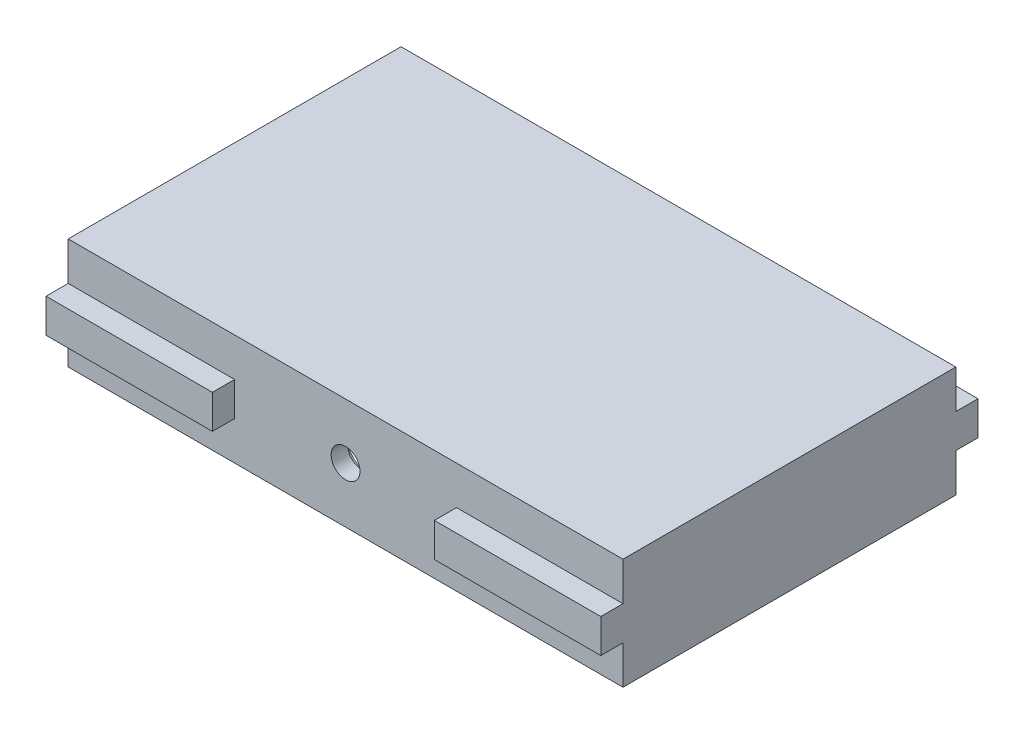
ISO-10303-21;
HEADER;
FILE_DESCRIPTION(('STEP AP214'),'2;1');
FILE_NAME('part.step','',(''),(''),'','','');
FILE_SCHEMA(('AUTOMOTIVE_DESIGN { 1 0 10303 214 1 1 1 1 }'));
ENDSEC;
DATA;
#1=APPLICATION_CONTEXT('core data for automotive mechanical design processes');
#2=APPLICATION_PROTOCOL_DEFINITION('international standard','automotive_design',2000,#1);
#3=PRODUCT_CONTEXT('',#1,'mechanical');
#4=PRODUCT('Part','Part','',(#3));
#5=PRODUCT_RELATED_PRODUCT_CATEGORY('part','',(#4));
#6=PRODUCT_DEFINITION_FORMATION('','',#4);
#7=PRODUCT_DEFINITION_CONTEXT('part definition',#1,'design');
#8=PRODUCT_DEFINITION('design','',#6,#7);
#9=PRODUCT_DEFINITION_SHAPE('','',#8);
#10=(LENGTH_UNIT() NAMED_UNIT(*) SI_UNIT(.MILLI.,.METRE.));
#11=(NAMED_UNIT(*) PLANE_ANGLE_UNIT() SI_UNIT($,.RADIAN.));
#12=(NAMED_UNIT(*) SI_UNIT($,.STERADIAN.) SOLID_ANGLE_UNIT());
#13=UNCERTAINTY_MEASURE_WITH_UNIT(LENGTH_MEASURE(1.E-05),#10,'distance_accuracy_value','');
#14=(GEOMETRIC_REPRESENTATION_CONTEXT(3) GLOBAL_UNCERTAINTY_ASSIGNED_CONTEXT((#13)) GLOBAL_UNIT_ASSIGNED_CONTEXT((#10,
#11,#12)) REPRESENTATION_CONTEXT('',''));
#15=CARTESIAN_POINT('',(0.,0.,0.));
#16=DIRECTION('',(0.,0.,1.));
#17=DIRECTION('',(1.,0.,0.));
#18=AXIS2_PLACEMENT_3D('',#15,#16,#17);
#19=CARTESIAN_POINT('',(-20.4498016419006,20.,43.5554216788532));
#20=DIRECTION('',(0.,0.,-1.));
#21=DIRECTION('',(-1.,0.,0.));
#22=AXIS2_PLACEMENT_3D('',#19,#20,#21);
#23=PLANE('',#22);
#24=CARTESIAN_POINT('',(29.5501983580994,10.,43.5554216788532));
#25=DIRECTION('',(0.,0.,1.));
#26=DIRECTION('',(1.,0.,0.));
#27=AXIS2_PLACEMENT_3D('',#24,#25,#26);
#28=CIRCLE('',#27,2.6);
#29=CARTESIAN_POINT('',(32.1501983580994,10.,43.5554216788532));
#30=VERTEX_POINT('',#29);
#31=EDGE_CURVE('E386',#30,#30,#28,.T.);
#32=ORIENTED_EDGE('',*,*,#31,.F.);
#33=EDGE_LOOP('',(#32));
#34=FACE_BOUND('',#33,.T.);
#35=DIRECTION('',(0.,-1.,0.));
#36=VECTOR('',#35,1.);
#37=CARTESIAN_POINT('',(79.5501983580994,20.,43.5554216788532));
#38=LINE('',#37,#36);
#39=CARTESIAN_POINT('',(79.5501983580994,6.94999999999999,43.5554216788532));
#40=VERTEX_POINT('',#39);
#41=CARTESIAN_POINT('',(79.5501983580994,0.,43.5554216788532));
#42=VERTEX_POINT('',#41);
#43=EDGE_CURVE('E479',#40,#42,#38,.T.);
#44=ORIENTED_EDGE('',*,*,#43,.F.);
#45=DIRECTION('',(-1.,0.,0.));
#46=VECTOR('',#45,1.);
#47=CARTESIAN_POINT('',(0.,6.94999999999998,43.5554216788532));
#48=LINE('',#47,#46);
#49=CARTESIAN_POINT('',(49.5501983580994,6.94999999999999,43.5554216788532));
#50=VERTEX_POINT('',#49);
#51=EDGE_CURVE('E59',#40,#50,#48,.T.);
#52=ORIENTED_EDGE('',*,*,#51,.T.);
#53=DIRECTION('',(0.,1.,0.));
#54=VECTOR('',#53,1.);
#55=CARTESIAN_POINT('',(49.5501983580994,0.,43.5554216788532));
#56=LINE('',#55,#54);
#57=CARTESIAN_POINT('',(49.5501983580994,13.05,43.5554216788532));
#58=VERTEX_POINT('',#57);
#59=EDGE_CURVE('E216',#50,#58,#56,.T.);
#60=ORIENTED_EDGE('',*,*,#59,.T.);
#61=DIRECTION('',(-1.,0.,0.));
#62=VECTOR('',#61,1.);
#63=CARTESIAN_POINT('',(0.,13.05,43.5554216788532));
#64=LINE('',#63,#62);
#65=CARTESIAN_POINT('',(79.5501983580994,13.05,43.5554216788532));
#66=VERTEX_POINT('',#65);
#67=EDGE_CURVE('E229',#66,#58,#64,.T.);
#68=ORIENTED_EDGE('',*,*,#67,.F.);
#69=CARTESIAN_POINT('',(79.5501983580994,20.,43.5554216788532));
#70=VERTEX_POINT('',#69);
#71=EDGE_CURVE('E480',#70,#66,#38,.T.);
#72=ORIENTED_EDGE('',*,*,#71,.F.);
#73=DIRECTION('',(1.,0.,0.));
#74=VECTOR('',#73,1.);
#75=CARTESIAN_POINT('',(-20.4498016419006,20.,43.5554216788532));
#76=LINE('',#75,#74);
#77=CARTESIAN_POINT('',(-20.4498016419006,20.,43.5554216788532));
#78=VERTEX_POINT('',#77);
#79=EDGE_CURVE('E446',#78,#70,#76,.T.);
#80=ORIENTED_EDGE('',*,*,#79,.F.);
#81=DIRECTION('',(0.,-1.,0.));
#82=VECTOR('',#81,1.);
#83=CARTESIAN_POINT('',(-20.4498016419006,20.,43.5554216788532));
#84=LINE('',#83,#82);
#85=CARTESIAN_POINT('',(-20.4498016419006,13.05,43.5554216788532));
#86=VERTEX_POINT('',#85);
#87=EDGE_CURVE('E11',#78,#86,#84,.T.);
#88=ORIENTED_EDGE('',*,*,#87,.T.);
#89=DIRECTION('',(1.,0.,0.));
#90=VECTOR('',#89,1.);
#91=CARTESIAN_POINT('',(0.,13.05,43.5554216788532));
#92=LINE('',#91,#90);
#93=CARTESIAN_POINT('',(9.55019835809942,13.05,43.5554216788532));
#94=VERTEX_POINT('',#93);
#95=EDGE_CURVE('E274',#86,#94,#92,.T.);
#96=ORIENTED_EDGE('',*,*,#95,.T.);
#97=DIRECTION('',(0.,-1.,0.));
#98=VECTOR('',#97,1.);
#99=CARTESIAN_POINT('',(9.55019835809942,0.,43.5554216788532));
#100=LINE('',#99,#98);
#101=CARTESIAN_POINT('',(9.55019835809942,6.94999999999999,43.5554216788532));
#102=VERTEX_POINT('',#101);
#103=EDGE_CURVE('E67',#94,#102,#100,.T.);
#104=ORIENTED_EDGE('',*,*,#103,.T.);
#105=DIRECTION('',(1.,0.,0.));
#106=VECTOR('',#105,1.);
#107=CARTESIAN_POINT('',(0.,6.94999999999999,43.5554216788532));
#108=LINE('',#107,#106);
#109=CARTESIAN_POINT('',(-20.4498016419006,6.94999999999999,43.5554216788532));
#110=VERTEX_POINT('',#109);
#111=EDGE_CURVE('E261',#110,#102,#108,.T.);
#112=ORIENTED_EDGE('',*,*,#111,.F.);
#113=CARTESIAN_POINT('',(-20.4498016419006,0.,43.5554216788532));
#114=VERTEX_POINT('',#113);
#115=EDGE_CURVE('E51',#110,#114,#84,.T.);
#116=ORIENTED_EDGE('',*,*,#115,.T.);
#117=DIRECTION('',(1.,0.,0.));
#118=VECTOR('',#117,1.);
#119=CARTESIAN_POINT('',(-20.4498016419006,0.,43.5554216788532));
#120=LINE('',#119,#118);
#121=EDGE_CURVE('E460',#114,#42,#120,.T.);
#122=ORIENTED_EDGE('',*,*,#121,.T.);
#123=EDGE_LOOP('',(#44,#52,#60,#68,#72,#80,#88,#96,#104,#112,#116,#122));
#124=FACE_BOUND('',#123,.T.);
#125=ADVANCED_FACE('F41',(#34,#124),#23,.F.);
#126=CARTESIAN_POINT('',(-20.4498016419006,20.,-16.4445783211468));
#127=DIRECTION('',(0.,0.,1.));
#128=DIRECTION('',(1.,0.,0.));
#129=AXIS2_PLACEMENT_3D('',#126,#127,#128);
#130=PLANE('',#129);
#131=CARTESIAN_POINT('',(29.5501983580994,10.,-16.4445783211468));
#132=DIRECTION('',(0.,0.,1.));
#133=DIRECTION('',(1.,0.,0.));
#134=AXIS2_PLACEMENT_3D('',#131,#132,#133);
#135=CIRCLE('',#134,2.6);
#136=CARTESIAN_POINT('',(32.1501983580994,10.,-16.4445783211468));
#137=VERTEX_POINT('',#136);
#138=EDGE_CURVE('E390',#137,#137,#135,.T.);
#139=ORIENTED_EDGE('',*,*,#138,.T.);
#140=EDGE_LOOP('',(#139));
#141=FACE_BOUND('',#140,.T.);
#142=DIRECTION('',(0.,-1.,0.));
#143=VECTOR('',#142,1.);
#144=CARTESIAN_POINT('',(79.5501983580994,20.,-16.4445783211468));
#145=LINE('',#144,#143);
#146=CARTESIAN_POINT('',(79.5501983580994,20.,-16.4445783211468));
#147=VERTEX_POINT('',#146);
#148=CARTESIAN_POINT('',(79.5501983580994,13.05,-16.4445783211468));
#149=VERTEX_POINT('',#148);
#150=EDGE_CURVE('E476',#147,#149,#145,.T.);
#151=ORIENTED_EDGE('',*,*,#150,.T.);
#152=DIRECTION('',(-1.,0.,0.));
#153=VECTOR('',#152,1.);
#154=CARTESIAN_POINT('',(0.,13.05,-16.4445783211468));
#155=LINE('',#154,#153);
#156=CARTESIAN_POINT('',(49.5501983580995,13.05,-16.4445783211468));
#157=VERTEX_POINT('',#156);
#158=EDGE_CURVE('E311',#149,#157,#155,.T.);
#159=ORIENTED_EDGE('',*,*,#158,.T.);
#160=DIRECTION('',(0.,-1.,0.));
#161=VECTOR('',#160,1.);
#162=CARTESIAN_POINT('',(49.5501983580994,0.,-16.4445783211468));
#163=LINE('',#162,#161);
#164=CARTESIAN_POINT('',(49.5501983580995,6.94999999999999,-16.4445783211468));
#165=VERTEX_POINT('',#164);
#166=EDGE_CURVE('E292',#157,#165,#163,.T.);
#167=ORIENTED_EDGE('',*,*,#166,.T.);
#168=DIRECTION('',(-1.,0.,0.));
#169=VECTOR('',#168,1.);
#170=CARTESIAN_POINT('',(0.,6.94999999999999,-16.4445783211468));
#171=LINE('',#170,#169);
#172=CARTESIAN_POINT('',(79.5501983580994,6.94999999999999,-16.4445783211468));
#173=VERTEX_POINT('',#172);
#174=EDGE_CURVE('E298',#173,#165,#171,.T.);
#175=ORIENTED_EDGE('',*,*,#174,.F.);
#176=CARTESIAN_POINT('',(79.5501983580994,0.,-16.4445783211468));
#177=VERTEX_POINT('',#176);
#178=EDGE_CURVE('E475',#173,#177,#145,.T.);
#179=ORIENTED_EDGE('',*,*,#178,.T.);
#180=DIRECTION('',(-1.,0.,0.));
#181=VECTOR('',#180,1.);
#182=CARTESIAN_POINT('',(-20.4498016419006,0.,-16.4445783211468));
#183=LINE('',#182,#181);
#184=CARTESIAN_POINT('',(-20.4498016419006,0.,-16.4445783211468));
#185=VERTEX_POINT('',#184);
#186=EDGE_CURVE('E447',#177,#185,#183,.T.);
#187=ORIENTED_EDGE('',*,*,#186,.T.);
#188=DIRECTION('',(0.,-1.,0.));
#189=VECTOR('',#188,1.);
#190=CARTESIAN_POINT('',(-20.4498016419006,20.,-16.4445783211468));
#191=LINE('',#190,#189);
#192=CARTESIAN_POINT('',(-20.4498016419006,6.94999999999999,-16.4445783211468));
#193=VERTEX_POINT('',#192);
#194=EDGE_CURVE('E456',#193,#185,#191,.T.);
#195=ORIENTED_EDGE('',*,*,#194,.F.);
#196=DIRECTION('',(1.,0.,0.));
#197=VECTOR('',#196,1.);
#198=CARTESIAN_POINT('',(0.,6.94999999999999,-16.4445783211468));
#199=LINE('',#198,#197);
#200=CARTESIAN_POINT('',(9.55019835809942,6.94999999999999,-16.4445783211468));
#201=VERTEX_POINT('',#200);
#202=EDGE_CURVE('E352',#193,#201,#199,.T.);
#203=ORIENTED_EDGE('',*,*,#202,.T.);
#204=DIRECTION('',(0.,1.,0.));
#205=VECTOR('',#204,1.);
#206=CARTESIAN_POINT('',(9.55019835809942,0.,-16.4445783211468));
#207=LINE('',#206,#205);
#208=CARTESIAN_POINT('',(9.55019835809942,13.05,-16.4445783211468));
#209=VERTEX_POINT('',#208);
#210=EDGE_CURVE('E332',#201,#209,#207,.T.);
#211=ORIENTED_EDGE('',*,*,#210,.T.);
#212=DIRECTION('',(1.,0.,0.));
#213=VECTOR('',#212,1.);
#214=CARTESIAN_POINT('',(0.,13.05,-16.4445783211468));
#215=LINE('',#214,#213);
#216=CARTESIAN_POINT('',(-20.4498016419006,13.05,-16.4445783211468));
#217=VERTEX_POINT('',#216);
#218=EDGE_CURVE('E338',#217,#209,#215,.T.);
#219=ORIENTED_EDGE('',*,*,#218,.F.);
#220=CARTESIAN_POINT('',(-20.4498016419006,20.,-16.4445783211468));
#221=VERTEX_POINT('',#220);
#222=EDGE_CURVE('E471',#221,#217,#191,.T.);
#223=ORIENTED_EDGE('',*,*,#222,.F.);
#224=DIRECTION('',(-1.,0.,0.));
#225=VECTOR('',#224,1.);
#226=CARTESIAN_POINT('',(-20.4498016419006,20.,-16.4445783211468));
#227=LINE('',#226,#225);
#228=EDGE_CURVE('E453',#147,#221,#227,.T.);
#229=ORIENTED_EDGE('',*,*,#228,.F.);
#230=EDGE_LOOP('',(#151,#159,#167,#175,#179,#187,#195,#203,#211,#219,#223,#229));
#231=FACE_BOUND('',#230,.T.);
#232=ADVANCED_FACE('F501',(#141,#231),#130,.F.);
#233=CARTESIAN_POINT('',(29.5501983580994,10.,-156.444578321147));
#234=DIRECTION('',(0.,0.,1.));
#235=DIRECTION('',(1.,0.,0.));
#236=AXIS2_PLACEMENT_3D('',#233,#234,#235);
#237=CYLINDRICAL_SURFACE('',#236,2.6);
#238=ORIENTED_EDGE('',*,*,#31,.T.);
#239=EDGE_LOOP('',(#238));
#240=FACE_BOUND('',#239,.T.);
#241=CARTESIAN_POINT('',(29.5501983580994,10.,40.5554216788532));
#242=DIRECTION('',(0.,0.,-1.));
#243=DIRECTION('',(-1.,0.,0.));
#244=AXIS2_PLACEMENT_3D('',#241,#242,#243);
#245=CIRCLE('',#244,2.6);
#246=CARTESIAN_POINT('',(26.9501983580994,10.,40.5554216788532));
#247=VERTEX_POINT('',#246);
#248=EDGE_CURVE('E45',#247,#247,#245,.F.);
#249=ORIENTED_EDGE('',*,*,#248,.F.);
#250=EDGE_LOOP('',(#249));
#251=FACE_BOUND('',#250,.T.);
#252=ADVANCED_FACE('F492',(#240,#251),#237,.F.);
#253=ORIENTED_EDGE('',*,*,#138,.F.);
#254=EDGE_LOOP('',(#253));
#255=FACE_BOUND('',#254,.T.);
#256=CARTESIAN_POINT('',(29.5501983580994,10.,-13.4445783211468));
#257=DIRECTION('',(0.,0.,1.));
#258=DIRECTION('',(1.,0.,0.));
#259=AXIS2_PLACEMENT_3D('',#256,#257,#258);
#260=CIRCLE('',#259,2.6);
#261=CARTESIAN_POINT('',(32.1501983580994,10.,-13.4445783211468));
#262=VERTEX_POINT('',#261);
#263=EDGE_CURVE('E382',#262,#262,#260,.F.);
#264=ORIENTED_EDGE('',*,*,#263,.F.);
#265=EDGE_LOOP('',(#264));
#266=FACE_BOUND('',#265,.T.);
#267=ADVANCED_FACE('F489',(#255,#266),#237,.F.);
#268=CARTESIAN_POINT('',(0.,0.,0.));
#269=DIRECTION('',(0.,1.,0.));
#270=DIRECTION('',(0.,0.,1.));
#271=AXIS2_PLACEMENT_3D('',#268,#269,#270);
#272=PLANE('',#271);
#273=DIRECTION('',(0.,0.,1.));
#274=VECTOR('',#273,1.);
#275=CARTESIAN_POINT('',(-20.4498016419006,0.,-16.4445783211468));
#276=LINE('',#275,#274);
#277=EDGE_CURVE('E432',#185,#114,#276,.T.);
#278=ORIENTED_EDGE('',*,*,#277,.F.);
#279=ORIENTED_EDGE('',*,*,#186,.F.);
#280=DIRECTION('',(0.,0.,-1.));
#281=VECTOR('',#280,1.);
#282=CARTESIAN_POINT('',(79.5501983580994,0.,-16.4445783211468));
#283=LINE('',#282,#281);
#284=EDGE_CURVE('E464',#42,#177,#283,.T.);
#285=ORIENTED_EDGE('',*,*,#284,.F.);
#286=ORIENTED_EDGE('',*,*,#121,.F.);
#287=EDGE_LOOP('',(#278,#279,#285,#286));
#288=FACE_BOUND('',#287,.T.);
#289=DIRECTION('',(0.,0.,-1.));
#290=VECTOR('',#289,1.);
#291=CARTESIAN_POINT('',(74.5501983580994,0.,0.));
#292=LINE('',#291,#290);
#293=CARTESIAN_POINT('',(74.5501983580994,0.,38.5554216788532));
#294=VERTEX_POINT('',#293);
#295=CARTESIAN_POINT('',(74.5501983580994,0.,-11.4445783211468));
#296=VERTEX_POINT('',#295);
#297=EDGE_CURVE('E394',#294,#296,#292,.T.);
#298=ORIENTED_EDGE('',*,*,#297,.T.);
#299=DIRECTION('',(1.,0.,0.));
#300=VECTOR('',#299,1.);
#301=CARTESIAN_POINT('',(0.,0.,-11.4445783211468));
#302=LINE('',#301,#300);
#303=CARTESIAN_POINT('',(-15.4498016419006,0.,-11.4445783211468));
#304=VERTEX_POINT('',#303);
#305=EDGE_CURVE('E400',#304,#296,#302,.T.);
#306=ORIENTED_EDGE('',*,*,#305,.F.);
#307=DIRECTION('',(0.,0.,-1.));
#308=VECTOR('',#307,1.);
#309=CARTESIAN_POINT('',(-15.4498016419006,0.,0.));
#310=LINE('',#309,#308);
#311=CARTESIAN_POINT('',(-15.4498016419006,0.,38.5554216788532));
#312=VERTEX_POINT('',#311);
#313=EDGE_CURVE('E422',#312,#304,#310,.T.);
#314=ORIENTED_EDGE('',*,*,#313,.F.);
#315=DIRECTION('',(1.,0.,0.));
#316=VECTOR('',#315,1.);
#317=CARTESIAN_POINT('',(0.,0.,38.5554216788532));
#318=LINE('',#317,#316);
#319=EDGE_CURVE('E418',#312,#294,#318,.T.);
#320=ORIENTED_EDGE('',*,*,#319,.T.);
#321=EDGE_LOOP('',(#298,#306,#314,#320));
#322=FACE_BOUND('',#321,.T.);
#323=ADVANCED_FACE('F491',(#288,#322),#272,.F.);
#324=CARTESIAN_POINT('',(-20.4498016419006,20.,-16.4445783211468));
#325=DIRECTION('',(1.,0.,0.));
#326=DIRECTION('',(0.,0.,-1.));
#327=AXIS2_PLACEMENT_3D('',#324,#325,#326);
#328=PLANE('',#327);
#329=ORIENTED_EDGE('',*,*,#277,.T.);
#330=ORIENTED_EDGE('',*,*,#115,.F.);
#331=DIRECTION('',(0.,0.,-1.));
#332=VECTOR('',#331,1.);
#333=CARTESIAN_POINT('',(-20.4498016419006,6.94999999999999,47.5554216788532));
#334=LINE('',#333,#332);
#335=CARTESIAN_POINT('',(-20.4498016419006,6.94999999999999,47.5554216788532));
#336=VERTEX_POINT('',#335);
#337=EDGE_CURVE('E283',#336,#110,#334,.T.);
#338=ORIENTED_EDGE('',*,*,#337,.F.);
#339=DIRECTION('',(0.,-1.,0.));
#340=VECTOR('',#339,1.);
#341=CARTESIAN_POINT('',(-20.4498016419006,0.,47.5554216788532));
#342=LINE('',#341,#340);
#343=CARTESIAN_POINT('',(-20.4498016419006,13.05,47.5554216788532));
#344=VERTEX_POINT('',#343);
#345=EDGE_CURVE('E265',#344,#336,#342,.T.);
#346=ORIENTED_EDGE('',*,*,#345,.F.);
#347=DIRECTION('',(0.,0.,-1.));
#348=VECTOR('',#347,1.);
#349=CARTESIAN_POINT('',(-20.4498016419006,13.05,47.5554216788532));
#350=LINE('',#349,#348);
#351=EDGE_CURVE('E286',#344,#86,#350,.T.);
#352=ORIENTED_EDGE('',*,*,#351,.T.);
#353=ORIENTED_EDGE('',*,*,#87,.F.);
#354=DIRECTION('',(0.,0.,1.));
#355=VECTOR('',#354,1.);
#356=CARTESIAN_POINT('',(-20.4498016419006,20.,-16.4445783211468));
#357=LINE('',#356,#355);
#358=EDGE_CURVE('E442',#221,#78,#357,.T.);
#359=ORIENTED_EDGE('',*,*,#358,.F.);
#360=ORIENTED_EDGE('',*,*,#222,.T.);
#361=DIRECTION('',(0.,0.,1.));
#362=VECTOR('',#361,1.);
#363=CARTESIAN_POINT('',(-20.4498016419006,13.05,-20.4445783211468));
#364=LINE('',#363,#362);
#365=CARTESIAN_POINT('',(-20.4498016419006,13.05,-20.4445783211468));
#366=VERTEX_POINT('',#365);
#367=EDGE_CURVE('E361',#366,#217,#364,.T.);
#368=ORIENTED_EDGE('',*,*,#367,.F.);
#369=DIRECTION('',(0.,1.,0.));
#370=VECTOR('',#369,1.);
#371=CARTESIAN_POINT('',(-20.4498016419006,0.,-20.4445783211468));
#372=LINE('',#371,#370);
#373=CARTESIAN_POINT('',(-20.4498016419006,6.94999999999999,-20.4445783211468));
#374=VERTEX_POINT('',#373);
#375=EDGE_CURVE('E342',#374,#366,#372,.T.);
#376=ORIENTED_EDGE('',*,*,#375,.F.);
#377=DIRECTION('',(0.,0.,1.));
#378=VECTOR('',#377,1.);
#379=CARTESIAN_POINT('',(-20.4498016419006,6.94999999999999,-20.4445783211468));
#380=LINE('',#379,#378);
#381=EDGE_CURVE('E364',#374,#193,#380,.T.);
#382=ORIENTED_EDGE('',*,*,#381,.T.);
#383=ORIENTED_EDGE('',*,*,#194,.T.);
#384=EDGE_LOOP('',(#329,#330,#338,#346,#352,#353,#359,#360,#368,#376,#382,#383));
#385=FACE_BOUND('',#384,.T.);
#386=ADVANCED_FACE('F43',(#385),#328,.F.);
#387=CARTESIAN_POINT('',(79.5501983580994,20.,-16.4445783211468));
#388=DIRECTION('',(-1.,0.,0.));
#389=DIRECTION('',(0.,0.,1.));
#390=AXIS2_PLACEMENT_3D('',#387,#388,#389);
#391=PLANE('',#390);
#392=ORIENTED_EDGE('',*,*,#284,.T.);
#393=ORIENTED_EDGE('',*,*,#178,.F.);
#394=DIRECTION('',(0.,0.,1.));
#395=VECTOR('',#394,1.);
#396=CARTESIAN_POINT('',(79.5501983580994,6.94999999999999,-20.4445783211468));
#397=LINE('',#396,#395);
#398=CARTESIAN_POINT('',(79.5501983580994,6.94999999999999,-20.4445783211468));
#399=VERTEX_POINT('',#398);
#400=EDGE_CURVE('E320',#399,#173,#397,.T.);
#401=ORIENTED_EDGE('',*,*,#400,.F.);
#402=DIRECTION('',(0.,-1.,0.));
#403=VECTOR('',#402,1.);
#404=CARTESIAN_POINT('',(79.5501983580994,0.,-20.4445783211468));
#405=LINE('',#404,#403);
#406=CARTESIAN_POINT('',(79.5501983580994,13.05,-20.4445783211468));
#407=VERTEX_POINT('',#406);
#408=EDGE_CURVE('E302',#407,#399,#405,.T.);
#409=ORIENTED_EDGE('',*,*,#408,.F.);
#410=DIRECTION('',(0.,0.,1.));
#411=VECTOR('',#410,1.);
#412=CARTESIAN_POINT('',(79.5501983580994,13.05,-20.4445783211468));
#413=LINE('',#412,#411);
#414=EDGE_CURVE('E324',#407,#149,#413,.T.);
#415=ORIENTED_EDGE('',*,*,#414,.T.);
#416=ORIENTED_EDGE('',*,*,#150,.F.);
#417=DIRECTION('',(0.,0.,-1.));
#418=VECTOR('',#417,1.);
#419=CARTESIAN_POINT('',(79.5501983580994,20.,-16.4445783211468));
#420=LINE('',#419,#418);
#421=EDGE_CURVE('E450',#70,#147,#420,.T.);
#422=ORIENTED_EDGE('',*,*,#421,.F.);
#423=ORIENTED_EDGE('',*,*,#71,.T.);
#424=DIRECTION('',(0.,0.,-1.));
#425=VECTOR('',#424,1.);
#426=CARTESIAN_POINT('',(79.5501983580994,13.05,47.5554216788532));
#427=LINE('',#426,#425);
#428=CARTESIAN_POINT('',(79.5501983580994,13.05,47.5554216788532));
#429=VERTEX_POINT('',#428);
#430=EDGE_CURVE('E251',#429,#66,#427,.T.);
#431=ORIENTED_EDGE('',*,*,#430,.F.);
#432=DIRECTION('',(0.,1.,0.));
#433=VECTOR('',#432,1.);
#434=CARTESIAN_POINT('',(79.5501983580994,0.,47.5554216788532));
#435=LINE('',#434,#433);
#436=CARTESIAN_POINT('',(79.5501983580994,6.94999999999999,47.5554216788532));
#437=VERTEX_POINT('',#436);
#438=EDGE_CURVE('E234',#437,#429,#435,.T.);
#439=ORIENTED_EDGE('',*,*,#438,.F.);
#440=DIRECTION('',(0.,0.,-1.));
#441=VECTOR('',#440,1.);
#442=CARTESIAN_POINT('',(79.5501983580994,6.94999999999999,47.5554216788532));
#443=LINE('',#442,#441);
#444=EDGE_CURVE('E219',#437,#40,#443,.T.);
#445=ORIENTED_EDGE('',*,*,#444,.T.);
#446=ORIENTED_EDGE('',*,*,#43,.T.);
#447=EDGE_LOOP('',(#392,#393,#401,#409,#415,#416,#422,#423,#431,#439,#445,#446));
#448=FACE_BOUND('',#447,.T.);
#449=ADVANCED_FACE('F516',(#448),#391,.F.);
#450=CARTESIAN_POINT('',(0.,20.,0.));
#451=DIRECTION('',(0.,1.,0.));
#452=DIRECTION('',(0.,0.,1.));
#453=AXIS2_PLACEMENT_3D('',#450,#451,#452);
#454=PLANE('',#453);
#455=ORIENTED_EDGE('',*,*,#358,.T.);
#456=ORIENTED_EDGE('',*,*,#79,.T.);
#457=ORIENTED_EDGE('',*,*,#421,.T.);
#458=ORIENTED_EDGE('',*,*,#228,.T.);
#459=EDGE_LOOP('',(#455,#456,#457,#458));
#460=FACE_BOUND('',#459,.T.);
#461=ADVANCED_FACE('F518',(#460),#454,.T.);
#462=CARTESIAN_POINT('',(74.5501983580994,15.,0.));
#463=DIRECTION('',(-1.,0.,0.));
#464=DIRECTION('',(0.,0.,1.));
#465=AXIS2_PLACEMENT_3D('',#462,#463,#464);
#466=PLANE('',#465);
#467=ORIENTED_EDGE('',*,*,#297,.F.);
#468=DIRECTION('',(0.,-1.,0.));
#469=VECTOR('',#468,1.);
#470=CARTESIAN_POINT('',(74.5501983580994,15.,38.5554216788532));
#471=LINE('',#470,#469);
#472=CARTESIAN_POINT('',(74.5501983580994,15.,38.5554216788532));
#473=VERTEX_POINT('',#472);
#474=EDGE_CURVE('E414',#473,#294,#471,.T.);
#475=ORIENTED_EDGE('',*,*,#474,.F.);
#476=DIRECTION('',(0.,0.,-1.));
#477=VECTOR('',#476,1.);
#478=CARTESIAN_POINT('',(74.5501983580994,15.,0.));
#479=LINE('',#478,#477);
#480=CARTESIAN_POINT('',(74.5501983580994,15.,-11.4445783211468));
#481=VERTEX_POINT('',#480);
#482=EDGE_CURVE('E395',#473,#481,#479,.T.);
#483=ORIENTED_EDGE('',*,*,#482,.T.);
#484=DIRECTION('',(0.,-1.,0.));
#485=VECTOR('',#484,1.);
#486=CARTESIAN_POINT('',(74.5501983580994,15.,-11.4445783211468));
#487=LINE('',#486,#485);
#488=EDGE_CURVE('E429',#481,#296,#487,.T.);
#489=ORIENTED_EDGE('',*,*,#488,.T.);
#490=EDGE_LOOP('',(#467,#475,#483,#489));
#491=FACE_BOUND('',#490,.T.);
#492=ADVANCED_FACE('F523',(#491),#466,.T.);
#493=CARTESIAN_POINT('',(0.,15.,-11.4445783211468));
#494=DIRECTION('',(0.,0.,-1.));
#495=DIRECTION('',(-1.,0.,0.));
#496=AXIS2_PLACEMENT_3D('',#493,#494,#495);
#497=PLANE('',#496);
#498=DIRECTION('',(1.,0.,0.));
#499=VECTOR('',#498,1.);
#500=CARTESIAN_POINT('',(0.,15.,-11.4445783211468));
#501=LINE('',#500,#499);
#502=CARTESIAN_POINT('',(29.5501983580994,15.,-11.4445783211468));
#503=VERTEX_POINT('',#502);
#504=EDGE_CURVE('E409',#503,#481,#501,.T.);
#505=ORIENTED_EDGE('',*,*,#504,.F.);
#506=CARTESIAN_POINT('',(29.5501983580994,10.,-11.4445783211468));
#507=DIRECTION('',(0.,0.,1.));
#508=DIRECTION('',(1.,0.,0.));
#509=AXIS2_PLACEMENT_3D('',#506,#507,#508);
#510=CIRCLE('',#509,5.);
#511=EDGE_CURVE('E383',#503,#503,#510,.T.);
#512=ORIENTED_EDGE('',*,*,#511,.F.);
#513=CARTESIAN_POINT('',(-15.4498016419006,15.,-11.4445783211468));
#514=VERTEX_POINT('',#513);
#515=EDGE_CURVE('E410',#514,#503,#501,.T.);
#516=ORIENTED_EDGE('',*,*,#515,.F.);
#517=DIRECTION('',(0.,-1.,0.));
#518=VECTOR('',#517,1.);
#519=CARTESIAN_POINT('',(-15.4498016419006,15.,-11.4445783211468));
#520=LINE('',#519,#518);
#521=EDGE_CURVE('E433',#514,#304,#520,.T.);
#522=ORIENTED_EDGE('',*,*,#521,.T.);
#523=ORIENTED_EDGE('',*,*,#305,.T.);
#524=ORIENTED_EDGE('',*,*,#488,.F.);
#525=EDGE_LOOP('',(#505,#512,#516,#522,#523,#524));
#526=FACE_BOUND('',#525,.T.);
#527=ADVANCED_FACE('F527',(#526),#497,.F.);
#528=CARTESIAN_POINT('',(-15.4498016419006,15.,0.));
#529=DIRECTION('',(-1.,0.,0.));
#530=DIRECTION('',(0.,0.,1.));
#531=AXIS2_PLACEMENT_3D('',#528,#529,#530);
#532=PLANE('',#531);
#533=ORIENTED_EDGE('',*,*,#313,.T.);
#534=ORIENTED_EDGE('',*,*,#521,.F.);
#535=DIRECTION('',(0.,0.,-1.));
#536=VECTOR('',#535,1.);
#537=CARTESIAN_POINT('',(-15.4498016419006,15.,0.));
#538=LINE('',#537,#536);
#539=CARTESIAN_POINT('',(-15.4498016419006,15.,38.5554216788532));
#540=VERTEX_POINT('',#539);
#541=EDGE_CURVE('E405',#540,#514,#538,.T.);
#542=ORIENTED_EDGE('',*,*,#541,.F.);
#543=DIRECTION('',(0.,-1.,0.));
#544=VECTOR('',#543,1.);
#545=CARTESIAN_POINT('',(-15.4498016419006,15.,38.5554216788532));
#546=LINE('',#545,#544);
#547=EDGE_CURVE('E436',#540,#312,#546,.T.);
#548=ORIENTED_EDGE('',*,*,#547,.T.);
#549=EDGE_LOOP('',(#533,#534,#542,#548));
#550=FACE_BOUND('',#549,.T.);
#551=ADVANCED_FACE('F533',(#550),#532,.F.);
#552=CARTESIAN_POINT('',(0.,15.,38.5554216788532));
#553=DIRECTION('',(0.,0.,-1.));
#554=DIRECTION('',(-1.,0.,0.));
#555=AXIS2_PLACEMENT_3D('',#552,#553,#554);
#556=PLANE('',#555);
#557=DIRECTION('',(1.,0.,0.));
#558=VECTOR('',#557,1.);
#559=CARTESIAN_POINT('',(0.,15.,38.5554216788532));
#560=LINE('',#559,#558);
#561=CARTESIAN_POINT('',(29.5501983580994,15.,38.5554216788532));
#562=VERTEX_POINT('',#561);
#563=EDGE_CURVE('E401',#540,#562,#560,.T.);
#564=ORIENTED_EDGE('',*,*,#563,.T.);
#565=CARTESIAN_POINT('',(29.5501983580994,10.,38.5554216788532));
#566=DIRECTION('',(0.,0.,-1.));
#567=DIRECTION('',(-1.,0.,0.));
#568=AXIS2_PLACEMENT_3D('',#565,#566,#567);
#569=CIRCLE('',#568,5.);
#570=EDGE_CURVE('E371',#562,#562,#569,.T.);
#571=ORIENTED_EDGE('',*,*,#570,.F.);
#572=EDGE_CURVE('E399',#562,#473,#560,.T.);
#573=ORIENTED_EDGE('',*,*,#572,.T.);
#574=ORIENTED_EDGE('',*,*,#474,.T.);
#575=ORIENTED_EDGE('',*,*,#319,.F.);
#576=ORIENTED_EDGE('',*,*,#547,.F.);
#577=EDGE_LOOP('',(#564,#571,#573,#574,#575,#576));
#578=FACE_BOUND('',#577,.T.);
#579=ADVANCED_FACE('F529',(#578),#556,.T.);
#580=CARTESIAN_POINT('',(0.,15.,0.));
#581=DIRECTION('',(0.,-1.,0.));
#582=DIRECTION('',(0.,0.,-1.));
#583=AXIS2_PLACEMENT_3D('',#580,#581,#582);
#584=PLANE('',#583);
#585=ORIENTED_EDGE('',*,*,#482,.F.);
#586=ORIENTED_EDGE('',*,*,#572,.F.);
#587=ORIENTED_EDGE('',*,*,#563,.F.);
#588=ORIENTED_EDGE('',*,*,#541,.T.);
#589=ORIENTED_EDGE('',*,*,#515,.T.);
#590=ORIENTED_EDGE('',*,*,#504,.T.);
#591=EDGE_LOOP('',(#585,#586,#587,#588,#589,#590));
#592=FACE_BOUND('',#591,.T.);
#593=ADVANCED_FACE('F532',(#592),#584,.T.);
#594=CARTESIAN_POINT('',(29.5501983580994,10.,-13.4445783211468));
#595=DIRECTION('',(0.,0.,1.));
#596=DIRECTION('',(1.,0.,0.));
#597=AXIS2_PLACEMENT_3D('',#594,#595,#596);
#598=PLANE('',#597);
#599=CARTESIAN_POINT('',(29.5501983580994,10.,-13.4445783211468));
#600=DIRECTION('',(0.,0.,1.));
#601=DIRECTION('',(1.,0.,0.));
#602=AXIS2_PLACEMENT_3D('',#599,#600,#601);
#603=CIRCLE('',#602,5.);
#604=CARTESIAN_POINT('',(34.5501983580994,10.,-13.4445783211468));
#605=VERTEX_POINT('',#604);
#606=EDGE_CURVE('E378',#605,#605,#603,.T.);
#607=ORIENTED_EDGE('',*,*,#606,.T.);
#608=EDGE_LOOP('',(#607));
#609=FACE_BOUND('',#608,.T.);
#610=ORIENTED_EDGE('',*,*,#263,.T.);
#611=EDGE_LOOP('',(#610));
#612=FACE_BOUND('',#611,.T.);
#613=ADVANCED_FACE('F487',(#609,#612),#598,.T.);
#614=CARTESIAN_POINT('',(29.5501983580994,10.,-13.4445783211468));
#615=DIRECTION('',(0.,0.,1.));
#616=DIRECTION('',(1.,0.,0.));
#617=AXIS2_PLACEMENT_3D('',#614,#615,#616);
#618=CYLINDRICAL_SURFACE('',#617,5.);
#619=ORIENTED_EDGE('',*,*,#606,.F.);
#620=EDGE_LOOP('',(#619));
#621=FACE_BOUND('',#620,.T.);
#622=ORIENTED_EDGE('',*,*,#511,.T.);
#623=EDGE_LOOP('',(#622));
#624=FACE_BOUND('',#623,.T.);
#625=ADVANCED_FACE('F545',(#621,#624),#618,.F.);
#626=CARTESIAN_POINT('',(29.5501983580994,10.,40.5554216788532));
#627=DIRECTION('',(0.,0.,-1.));
#628=DIRECTION('',(-1.,0.,0.));
#629=AXIS2_PLACEMENT_3D('',#626,#627,#628);
#630=PLANE('',#629);
#631=CARTESIAN_POINT('',(29.5501983580994,10.,40.5554216788532));
#632=DIRECTION('',(0.,0.,-1.));
#633=DIRECTION('',(-1.,0.,0.));
#634=AXIS2_PLACEMENT_3D('',#631,#632,#633);
#635=CIRCLE('',#634,5.);
#636=CARTESIAN_POINT('',(24.5501983580994,10.,40.5554216788532));
#637=VERTEX_POINT('',#636);
#638=EDGE_CURVE('E372',#637,#637,#635,.T.);
#639=ORIENTED_EDGE('',*,*,#638,.T.);
#640=EDGE_LOOP('',(#639));
#641=FACE_BOUND('',#640,.T.);
#642=ORIENTED_EDGE('',*,*,#248,.T.);
#643=EDGE_LOOP('',(#642));
#644=FACE_BOUND('',#643,.T.);
#645=ADVANCED_FACE('F650',(#641,#644),#630,.T.);
#646=CARTESIAN_POINT('',(29.5501983580994,10.,40.5554216788532));
#647=DIRECTION('',(0.,0.,-1.));
#648=DIRECTION('',(-1.,0.,0.));
#649=AXIS2_PLACEMENT_3D('',#646,#647,#648);
#650=CYLINDRICAL_SURFACE('',#649,5.);
#651=ORIENTED_EDGE('',*,*,#638,.F.);
#652=EDGE_LOOP('',(#651));
#653=FACE_BOUND('',#652,.T.);
#654=ORIENTED_EDGE('',*,*,#570,.T.);
#655=EDGE_LOOP('',(#654));
#656=FACE_BOUND('',#655,.T.);
#657=ADVANCED_FACE('F648',(#653,#656),#650,.F.);
#658=CARTESIAN_POINT('',(9.55019835809942,0.,-20.4445783211468));
#659=DIRECTION('',(1.,0.,0.));
#660=DIRECTION('',(0.,0.,-1.));
#661=AXIS2_PLACEMENT_3D('',#658,#659,#660);
#662=PLANE('',#661);
#663=ORIENTED_EDGE('',*,*,#210,.F.);
#664=DIRECTION('',(0.,0.,1.));
#665=VECTOR('',#664,1.);
#666=CARTESIAN_POINT('',(9.55019835809942,6.94999999999999,-20.4445783211468));
#667=LINE('',#666,#665);
#668=CARTESIAN_POINT('',(9.55019835809942,6.94999999999999,-20.4445783211468));
#669=VERTEX_POINT('',#668);
#670=EDGE_CURVE('E367',#669,#201,#667,.T.);
#671=ORIENTED_EDGE('',*,*,#670,.F.);
#672=DIRECTION('',(0.,1.,0.));
#673=VECTOR('',#672,1.);
#674=CARTESIAN_POINT('',(9.55019835809942,0.,-20.4445783211468));
#675=LINE('',#674,#673);
#676=CARTESIAN_POINT('',(9.55019835809942,13.05,-20.4445783211468));
#677=VERTEX_POINT('',#676);
#678=EDGE_CURVE('E333',#669,#677,#675,.T.);
#679=ORIENTED_EDGE('',*,*,#678,.T.);
#680=DIRECTION('',(0.,0.,1.));
#681=VECTOR('',#680,1.);
#682=CARTESIAN_POINT('',(9.55019835809942,13.05,-20.4445783211468));
#683=LINE('',#682,#681);
#684=EDGE_CURVE('E348',#677,#209,#683,.T.);
#685=ORIENTED_EDGE('',*,*,#684,.T.);
#686=EDGE_LOOP('',(#663,#671,#679,#685));
#687=FACE_BOUND('',#686,.T.);
#688=ADVANCED_FACE('F644',(#687),#662,.T.);
#689=CARTESIAN_POINT('',(0.,6.94999999999999,-20.4445783211468));
#690=DIRECTION('',(0.,-1.,0.));
#691=DIRECTION('',(1.,0.,0.));
#692=AXIS2_PLACEMENT_3D('',#689,#690,#691);
#693=PLANE('',#692);
#694=ORIENTED_EDGE('',*,*,#202,.F.);
#695=ORIENTED_EDGE('',*,*,#381,.F.);
#696=DIRECTION('',(1.,0.,0.));
#697=VECTOR('',#696,1.);
#698=CARTESIAN_POINT('',(0.,6.94999999999999,-20.4445783211468));
#699=LINE('',#698,#697);
#700=EDGE_CURVE('E337',#374,#669,#699,.T.);
#701=ORIENTED_EDGE('',*,*,#700,.T.);
#702=ORIENTED_EDGE('',*,*,#670,.T.);
#703=EDGE_LOOP('',(#694,#695,#701,#702));
#704=FACE_BOUND('',#703,.T.);
#705=ADVANCED_FACE('F640',(#704),#693,.T.);
#706=CARTESIAN_POINT('',(0.,13.05,-20.4445783211468));
#707=DIRECTION('',(0.,-1.,0.));
#708=DIRECTION('',(1.,0.,0.));
#709=AXIS2_PLACEMENT_3D('',#706,#707,#708);
#710=PLANE('',#709);
#711=ORIENTED_EDGE('',*,*,#218,.T.);
#712=ORIENTED_EDGE('',*,*,#684,.F.);
#713=DIRECTION('',(1.,0.,0.));
#714=VECTOR('',#713,1.);
#715=CARTESIAN_POINT('',(0.,13.05,-20.4445783211468));
#716=LINE('',#715,#714);
#717=EDGE_CURVE('E345',#366,#677,#716,.T.);
#718=ORIENTED_EDGE('',*,*,#717,.F.);
#719=ORIENTED_EDGE('',*,*,#367,.T.);
#720=EDGE_LOOP('',(#711,#712,#718,#719));
#721=FACE_BOUND('',#720,.T.);
#722=ADVANCED_FACE('F636',(#721),#710,.F.);
#723=CARTESIAN_POINT('',(0.,0.,-20.4445783211468));
#724=DIRECTION('',(0.,0.,-1.));
#725=DIRECTION('',(-1.,0.,0.));
#726=AXIS2_PLACEMENT_3D('',#723,#724,#725);
#727=PLANE('',#726);
#728=ORIENTED_EDGE('',*,*,#678,.F.);
#729=ORIENTED_EDGE('',*,*,#700,.F.);
#730=ORIENTED_EDGE('',*,*,#375,.T.);
#731=ORIENTED_EDGE('',*,*,#717,.T.);
#732=EDGE_LOOP('',(#728,#729,#730,#731));
#733=FACE_BOUND('',#732,.T.);
#734=ADVANCED_FACE('F632',(#733),#727,.T.);
#735=CARTESIAN_POINT('',(49.5501983580994,0.,-20.4445783211468));
#736=DIRECTION('',(-1.,0.,0.));
#737=DIRECTION('',(0.,0.,1.));
#738=AXIS2_PLACEMENT_3D('',#735,#736,#737);
#739=PLANE('',#738);
#740=ORIENTED_EDGE('',*,*,#166,.F.);
#741=DIRECTION('',(0.,0.,1.));
#742=VECTOR('',#741,1.);
#743=CARTESIAN_POINT('',(49.5501983580994,13.05,-20.4445783211468));
#744=LINE('',#743,#742);
#745=CARTESIAN_POINT('',(49.5501983580994,13.05,-20.4445783211468));
#746=VERTEX_POINT('',#745);
#747=EDGE_CURVE('E328',#746,#157,#744,.T.);
#748=ORIENTED_EDGE('',*,*,#747,.F.);
#749=DIRECTION('',(0.,-1.,0.));
#750=VECTOR('',#749,1.);
#751=CARTESIAN_POINT('',(49.5501983580994,0.,-20.4445783211468));
#752=LINE('',#751,#750);
#753=CARTESIAN_POINT('',(49.5501983580994,6.94999999999999,-20.4445783211468));
#754=VERTEX_POINT('',#753);
#755=EDGE_CURVE('E293',#746,#754,#752,.T.);
#756=ORIENTED_EDGE('',*,*,#755,.T.);
#757=DIRECTION('',(0.,0.,1.));
#758=VECTOR('',#757,1.);
#759=CARTESIAN_POINT('',(49.5501983580994,6.94999999999999,-20.4445783211468));
#760=LINE('',#759,#758);
#761=EDGE_CURVE('E308',#754,#165,#760,.T.);
#762=ORIENTED_EDGE('',*,*,#761,.T.);
#763=EDGE_LOOP('',(#740,#748,#756,#762));
#764=FACE_BOUND('',#763,.T.);
#765=ADVANCED_FACE('F628',(#764),#739,.T.);
#766=CARTESIAN_POINT('',(0.,13.05,-20.4445783211468));
#767=DIRECTION('',(0.,1.,0.));
#768=DIRECTION('',(0.,0.,1.));
#769=AXIS2_PLACEMENT_3D('',#766,#767,#768);
#770=PLANE('',#769);
#771=ORIENTED_EDGE('',*,*,#158,.F.);
#772=ORIENTED_EDGE('',*,*,#414,.F.);
#773=DIRECTION('',(-1.,0.,0.));
#774=VECTOR('',#773,1.);
#775=CARTESIAN_POINT('',(0.,13.05,-20.4445783211468));
#776=LINE('',#775,#774);
#777=EDGE_CURVE('E297',#407,#746,#776,.T.);
#778=ORIENTED_EDGE('',*,*,#777,.T.);
#779=ORIENTED_EDGE('',*,*,#747,.T.);
#780=EDGE_LOOP('',(#771,#772,#778,#779));
#781=FACE_BOUND('',#780,.T.);
#782=ADVANCED_FACE('F624',(#781),#770,.T.);
#783=CARTESIAN_POINT('',(0.,6.94999999999999,-20.4445783211468));
#784=DIRECTION('',(0.,1.,0.));
#785=DIRECTION('',(0.,0.,1.));
#786=AXIS2_PLACEMENT_3D('',#783,#784,#785);
#787=PLANE('',#786);
#788=ORIENTED_EDGE('',*,*,#174,.T.);
#789=ORIENTED_EDGE('',*,*,#761,.F.);
#790=DIRECTION('',(-1.,0.,0.));
#791=VECTOR('',#790,1.);
#792=CARTESIAN_POINT('',(0.,6.94999999999999,-20.4445783211468));
#793=LINE('',#792,#791);
#794=EDGE_CURVE('E305',#399,#754,#793,.T.);
#795=ORIENTED_EDGE('',*,*,#794,.F.);
#796=ORIENTED_EDGE('',*,*,#400,.T.);
#797=EDGE_LOOP('',(#788,#789,#795,#796));
#798=FACE_BOUND('',#797,.T.);
#799=ADVANCED_FACE('F620',(#798),#787,.F.);
#800=CARTESIAN_POINT('',(0.,0.,-20.4445783211468));
#801=DIRECTION('',(0.,0.,-1.));
#802=DIRECTION('',(-1.,0.,0.));
#803=AXIS2_PLACEMENT_3D('',#800,#801,#802);
#804=PLANE('',#803);
#805=ORIENTED_EDGE('',*,*,#755,.F.);
#806=ORIENTED_EDGE('',*,*,#777,.F.);
#807=ORIENTED_EDGE('',*,*,#408,.T.);
#808=ORIENTED_EDGE('',*,*,#794,.T.);
#809=EDGE_LOOP('',(#805,#806,#807,#808));
#810=FACE_BOUND('',#809,.T.);
#811=ADVANCED_FACE('F617',(#810),#804,.T.);
#812=CARTESIAN_POINT('',(9.55019835809942,0.,47.5554216788532));
#813=DIRECTION('',(1.,0.,0.));
#814=DIRECTION('',(0.,0.,-1.));
#815=AXIS2_PLACEMENT_3D('',#812,#813,#814);
#816=PLANE('',#815);
#817=ORIENTED_EDGE('',*,*,#103,.F.);
#818=DIRECTION('',(0.,0.,-1.));
#819=VECTOR('',#818,1.);
#820=CARTESIAN_POINT('',(9.55019835809942,13.05,47.5554216788532));
#821=LINE('',#820,#819);
#822=CARTESIAN_POINT('',(9.55019835809942,13.05,47.5554216788532));
#823=VERTEX_POINT('',#822);
#824=EDGE_CURVE('E289',#823,#94,#821,.T.);
#825=ORIENTED_EDGE('',*,*,#824,.F.);
#826=DIRECTION('',(0.,-1.,0.));
#827=VECTOR('',#826,1.);
#828=CARTESIAN_POINT('',(9.55019835809942,0.,47.5554216788532));
#829=LINE('',#828,#827);
#830=CARTESIAN_POINT('',(9.55019835809942,6.94999999999999,47.5554216788532));
#831=VERTEX_POINT('',#830);
#832=EDGE_CURVE('E256',#823,#831,#829,.T.);
#833=ORIENTED_EDGE('',*,*,#832,.T.);
#834=DIRECTION('',(0.,0.,-1.));
#835=VECTOR('',#834,1.);
#836=CARTESIAN_POINT('',(9.55019835809942,6.94999999999999,47.5554216788532));
#837=LINE('',#836,#835);
#838=EDGE_CURVE('E271',#831,#102,#837,.T.);
#839=ORIENTED_EDGE('',*,*,#838,.T.);
#840=EDGE_LOOP('',(#817,#825,#833,#839));
#841=FACE_BOUND('',#840,.T.);
#842=ADVANCED_FACE('F598',(#841),#816,.T.);
#843=CARTESIAN_POINT('',(0.,13.05,47.5554216788532));
#844=DIRECTION('',(0.,1.,0.));
#845=DIRECTION('',(0.,0.,1.));
#846=AXIS2_PLACEMENT_3D('',#843,#844,#845);
#847=PLANE('',#846);
#848=ORIENTED_EDGE('',*,*,#95,.F.);
#849=ORIENTED_EDGE('',*,*,#351,.F.);
#850=DIRECTION('',(1.,0.,0.));
#851=VECTOR('',#850,1.);
#852=CARTESIAN_POINT('',(0.,13.05,47.5554216788532));
#853=LINE('',#852,#851);
#854=EDGE_CURVE('E260',#344,#823,#853,.T.);
#855=ORIENTED_EDGE('',*,*,#854,.T.);
#856=ORIENTED_EDGE('',*,*,#824,.T.);
#857=EDGE_LOOP('',(#848,#849,#855,#856));
#858=FACE_BOUND('',#857,.T.);
#859=ADVANCED_FACE('F596',(#858),#847,.T.);
#860=CARTESIAN_POINT('',(0.,6.94999999999999,47.5554216788532));
#861=DIRECTION('',(0.,1.,0.));
#862=DIRECTION('',(0.,0.,1.));
#863=AXIS2_PLACEMENT_3D('',#860,#861,#862);
#864=PLANE('',#863);
#865=ORIENTED_EDGE('',*,*,#111,.T.);
#866=ORIENTED_EDGE('',*,*,#838,.F.);
#867=DIRECTION('',(1.,0.,0.));
#868=VECTOR('',#867,1.);
#869=CARTESIAN_POINT('',(0.,6.94999999999999,47.5554216788532));
#870=LINE('',#869,#868);
#871=EDGE_CURVE('E268',#336,#831,#870,.T.);
#872=ORIENTED_EDGE('',*,*,#871,.F.);
#873=ORIENTED_EDGE('',*,*,#337,.T.);
#874=EDGE_LOOP('',(#865,#866,#872,#873));
#875=FACE_BOUND('',#874,.T.);
#876=ADVANCED_FACE('F604',(#875),#864,.F.);
#877=CARTESIAN_POINT('',(0.,0.,47.5554216788532));
#878=DIRECTION('',(0.,0.,1.));
#879=DIRECTION('',(1.,0.,0.));
#880=AXIS2_PLACEMENT_3D('',#877,#878,#879);
#881=PLANE('',#880);
#882=ORIENTED_EDGE('',*,*,#832,.F.);
#883=ORIENTED_EDGE('',*,*,#854,.F.);
#884=ORIENTED_EDGE('',*,*,#345,.T.);
#885=ORIENTED_EDGE('',*,*,#871,.T.);
#886=EDGE_LOOP('',(#882,#883,#884,#885));
#887=FACE_BOUND('',#886,.T.);
#888=ADVANCED_FACE('F600',(#887),#881,.T.);
#889=CARTESIAN_POINT('',(49.5501983580994,0.,47.5554216788532));
#890=DIRECTION('',(-1.,0.,0.));
#891=DIRECTION('',(0.,0.,1.));
#892=AXIS2_PLACEMENT_3D('',#889,#890,#891);
#893=PLANE('',#892);
#894=ORIENTED_EDGE('',*,*,#59,.F.);
#895=DIRECTION('',(0.,0.,-1.));
#896=VECTOR('',#895,1.);
#897=CARTESIAN_POINT('',(49.5501983580994,6.94999999999999,47.5554216788532));
#898=LINE('',#897,#896);
#899=CARTESIAN_POINT('',(49.5501983580994,6.94999999999999,47.5554216788532));
#900=VERTEX_POINT('',#899);
#901=EDGE_CURVE('E211',#900,#50,#898,.T.);
#902=ORIENTED_EDGE('',*,*,#901,.F.);
#903=DIRECTION('',(0.,1.,0.));
#904=VECTOR('',#903,1.);
#905=CARTESIAN_POINT('',(49.5501983580994,0.,47.5554216788532));
#906=LINE('',#905,#904);
#907=CARTESIAN_POINT('',(49.5501983580994,13.05,47.5554216788532));
#908=VERTEX_POINT('',#907);
#909=EDGE_CURVE('E214',#900,#908,#906,.T.);
#910=ORIENTED_EDGE('',*,*,#909,.T.);
#911=DIRECTION('',(0.,0.,-1.));
#912=VECTOR('',#911,1.);
#913=CARTESIAN_POINT('',(49.5501983580994,13.05,47.5554216788532));
#914=LINE('',#913,#912);
#915=EDGE_CURVE('E241',#908,#58,#914,.T.);
#916=ORIENTED_EDGE('',*,*,#915,.T.);
#917=EDGE_LOOP('',(#894,#902,#910,#916));
#918=FACE_BOUND('',#917,.T.);
#919=ADVANCED_FACE('F213',(#918),#893,.T.);
#920=CARTESIAN_POINT('',(0.,6.94999999999998,47.5554216788532));
#921=DIRECTION('',(0.,-1.,0.));
#922=DIRECTION('',(1.,0.,0.));
#923=AXIS2_PLACEMENT_3D('',#920,#921,#922);
#924=PLANE('',#923);
#925=ORIENTED_EDGE('',*,*,#51,.F.);
#926=ORIENTED_EDGE('',*,*,#444,.F.);
#927=DIRECTION('',(-1.,0.,0.));
#928=VECTOR('',#927,1.);
#929=CARTESIAN_POINT('',(0.,6.94999999999998,47.5554216788532));
#930=LINE('',#929,#928);
#931=EDGE_CURVE('E224',#437,#900,#930,.T.);
#932=ORIENTED_EDGE('',*,*,#931,.T.);
#933=ORIENTED_EDGE('',*,*,#901,.T.);
#934=EDGE_LOOP('',(#925,#926,#932,#933));
#935=FACE_BOUND('',#934,.T.);
#936=ADVANCED_FACE('F231',(#935),#924,.T.);
#937=CARTESIAN_POINT('',(0.,13.05,47.5554216788532));
#938=DIRECTION('',(0.,-1.,0.));
#939=DIRECTION('',(1.,0.,0.));
#940=AXIS2_PLACEMENT_3D('',#937,#938,#939);
#941=PLANE('',#940);
#942=ORIENTED_EDGE('',*,*,#67,.T.);
#943=ORIENTED_EDGE('',*,*,#915,.F.);
#944=DIRECTION('',(-1.,0.,0.));
#945=VECTOR('',#944,1.);
#946=CARTESIAN_POINT('',(0.,13.05,47.5554216788532));
#947=LINE('',#946,#945);
#948=EDGE_CURVE('E226',#429,#908,#947,.T.);
#949=ORIENTED_EDGE('',*,*,#948,.F.);
#950=ORIENTED_EDGE('',*,*,#430,.T.);
#951=EDGE_LOOP('',(#942,#943,#949,#950));
#952=FACE_BOUND('',#951,.T.);
#953=ADVANCED_FACE('F743',(#952),#941,.F.);
#954=CARTESIAN_POINT('',(0.,0.,47.5554216788532));
#955=DIRECTION('',(0.,0.,1.));
#956=DIRECTION('',(1.,0.,0.));
#957=AXIS2_PLACEMENT_3D('',#954,#955,#956);
#958=PLANE('',#957);
#959=ORIENTED_EDGE('',*,*,#909,.F.);
#960=ORIENTED_EDGE('',*,*,#931,.F.);
#961=ORIENTED_EDGE('',*,*,#438,.T.);
#962=ORIENTED_EDGE('',*,*,#948,.T.);
#963=EDGE_LOOP('',(#959,#960,#961,#962));
#964=FACE_BOUND('',#963,.T.);
#965=ADVANCED_FACE('F223',(#964),#958,.T.);
#966=CLOSED_SHELL('',(#125,#232,#252,#267,#323,#386,#449,#461,#492,#527,#551,#579,#593,#613,
#625,#645,#657,#688,#705,#722,#734,#765,#782,#799,#811,#842,#859,#876,#888,#919,#936,#953,#965));
#967=MANIFOLD_SOLID_BREP('B2',#966);
#968=ADVANCED_BREP_SHAPE_REPRESENTATION('',(#18,#967),#14);
#969=SHAPE_DEFINITION_REPRESENTATION(#9,#968);
ENDSEC;
END-ISO-10303-21;
